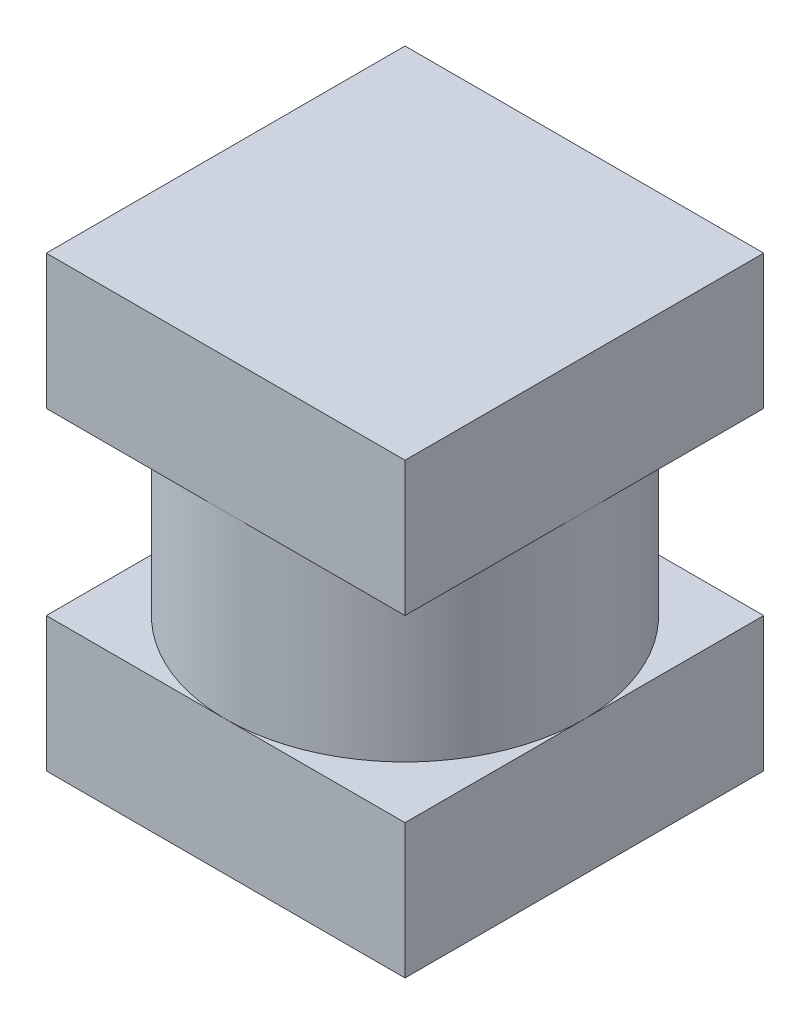
ISO-10303-21;
HEADER;
FILE_DESCRIPTION(('STEP AP214'),'2;1');
FILE_NAME('part.step','',(''),(''),'','','');
FILE_SCHEMA(('AUTOMOTIVE_DESIGN { 1 0 10303 214 1 1 1 1 }'));
ENDSEC;
DATA;
#1=APPLICATION_CONTEXT('core data for automotive mechanical design processes');
#2=APPLICATION_PROTOCOL_DEFINITION('international standard','automotive_design',2000,#1);
#3=PRODUCT_CONTEXT('',#1,'mechanical');
#4=PRODUCT('Part','Part','',(#3));
#5=PRODUCT_RELATED_PRODUCT_CATEGORY('part','',(#4));
#6=PRODUCT_DEFINITION_FORMATION('','',#4);
#7=PRODUCT_DEFINITION_CONTEXT('part definition',#1,'design');
#8=PRODUCT_DEFINITION('design','',#6,#7);
#9=PRODUCT_DEFINITION_SHAPE('','',#8);
#10=(LENGTH_UNIT() NAMED_UNIT(*) SI_UNIT(.MILLI.,.METRE.));
#11=(NAMED_UNIT(*) PLANE_ANGLE_UNIT() SI_UNIT($,.RADIAN.));
#12=(NAMED_UNIT(*) SI_UNIT($,.STERADIAN.) SOLID_ANGLE_UNIT());
#13=UNCERTAINTY_MEASURE_WITH_UNIT(LENGTH_MEASURE(1.E-05),#10,'distance_accuracy_value','');
#14=(GEOMETRIC_REPRESENTATION_CONTEXT(3) GLOBAL_UNCERTAINTY_ASSIGNED_CONTEXT((#13)) GLOBAL_UNIT_ASSIGNED_CONTEXT((#10,
#11,#12)) REPRESENTATION_CONTEXT('',''));
#15=CARTESIAN_POINT('',(0.,0.,0.));
#16=DIRECTION('',(0.,0.,1.));
#17=DIRECTION('',(1.,0.,0.));
#18=AXIS2_PLACEMENT_3D('',#15,#16,#17);
#19=CARTESIAN_POINT('',(0.,15.,0.));
#20=DIRECTION('',(0.,1.,0.));
#21=DIRECTION('',(0.,0.,1.));
#22=AXIS2_PLACEMENT_3D('',#19,#20,#21);
#23=PLANE('',#22);
#24=CARTESIAN_POINT('',(0.,15.,0.));
#25=DIRECTION('',(0.,1.,0.));
#26=DIRECTION('',(0.,0.,1.));
#27=AXIS2_PLACEMENT_3D('',#24,#25,#26);
#28=CIRCLE('',#27,20.);
#29=CARTESIAN_POINT('',(0.,15.,20.));
#30=VERTEX_POINT('',#29);
#31=CARTESIAN_POINT('',(20.,15.,0.));
#32=VERTEX_POINT('',#31);
#33=EDGE_CURVE('E46',#30,#32,#28,.T.);
#34=ORIENTED_EDGE('',*,*,#33,.F.);
#35=DIRECTION('',(1.,0.,0.));
#36=VECTOR('',#35,1.);
#37=CARTESIAN_POINT('',(-20.,15.,20.));
#38=LINE('',#37,#36);
#39=CARTESIAN_POINT('',(20.,15.,20.));
#40=VERTEX_POINT('',#39);
#41=EDGE_CURVE('E176',#30,#40,#38,.T.);
#42=ORIENTED_EDGE('',*,*,#41,.T.);
#43=DIRECTION('',(0.,0.,-1.));
#44=VECTOR('',#43,1.);
#45=CARTESIAN_POINT('',(20.,15.,-20.));
#46=LINE('',#45,#44);
#47=EDGE_CURVE('E164',#40,#32,#46,.T.);
#48=ORIENTED_EDGE('',*,*,#47,.T.);
#49=EDGE_LOOP('',(#34,#42,#48));
#50=FACE_BOUND('',#49,.T.);
#51=ADVANCED_FACE('F35',(#50),#23,.T.);
#52=CARTESIAN_POINT('',(0.,15.,-20.));
#53=VERTEX_POINT('',#52);
#54=EDGE_CURVE('E11',#32,#53,#28,.T.);
#55=ORIENTED_EDGE('',*,*,#54,.F.);
#56=CARTESIAN_POINT('',(20.,15.,-20.));
#57=VERTEX_POINT('',#56);
#58=EDGE_CURVE('E168',#32,#57,#46,.T.);
#59=ORIENTED_EDGE('',*,*,#58,.T.);
#60=DIRECTION('',(-1.,0.,0.));
#61=VECTOR('',#60,1.);
#62=CARTESIAN_POINT('',(-20.,15.,-20.));
#63=LINE('',#62,#61);
#64=EDGE_CURVE('E169',#57,#53,#63,.T.);
#65=ORIENTED_EDGE('',*,*,#64,.T.);
#66=EDGE_LOOP('',(#55,#59,#65));
#67=FACE_BOUND('',#66,.T.);
#68=ADVANCED_FACE('F211',(#67),#23,.T.);
#69=CARTESIAN_POINT('',(-20.,15.,0.));
#70=VERTEX_POINT('',#69);
#71=EDGE_CURVE('E44',#53,#70,#28,.T.);
#72=ORIENTED_EDGE('',*,*,#71,.F.);
#73=CARTESIAN_POINT('',(-20.,15.,-20.));
#74=VERTEX_POINT('',#73);
#75=EDGE_CURVE('E167',#53,#74,#63,.T.);
#76=ORIENTED_EDGE('',*,*,#75,.T.);
#77=DIRECTION('',(0.,0.,1.));
#78=VECTOR('',#77,1.);
#79=CARTESIAN_POINT('',(-20.,15.,-20.));
#80=LINE('',#79,#78);
#81=EDGE_CURVE('E173',#74,#70,#80,.T.);
#82=ORIENTED_EDGE('',*,*,#81,.T.);
#83=EDGE_LOOP('',(#72,#76,#82));
#84=FACE_BOUND('',#83,.T.);
#85=ADVANCED_FACE('F208',(#84),#23,.T.);
#86=CARTESIAN_POINT('',(20.,15.,-20.));
#87=DIRECTION('',(-1.,0.,0.));
#88=DIRECTION('',(0.,0.,1.));
#89=AXIS2_PLACEMENT_3D('',#86,#87,#88);
#90=PLANE('',#89);
#91=DIRECTION('',(0.,0.,-1.));
#92=VECTOR('',#91,1.);
#93=CARTESIAN_POINT('',(20.,0.,-20.));
#94=LINE('',#93,#92);
#95=CARTESIAN_POINT('',(20.,0.,20.));
#96=VERTEX_POINT('',#95);
#97=CARTESIAN_POINT('',(20.,0.,-20.));
#98=VERTEX_POINT('',#97);
#99=EDGE_CURVE('E161',#96,#98,#94,.T.);
#100=ORIENTED_EDGE('',*,*,#99,.T.);
#101=DIRECTION('',(0.,-1.,0.));
#102=VECTOR('',#101,1.);
#103=CARTESIAN_POINT('',(20.,15.,-20.));
#104=LINE('',#103,#102);
#105=EDGE_CURVE('E39',#57,#98,#104,.T.);
#106=ORIENTED_EDGE('',*,*,#105,.F.);
#107=ORIENTED_EDGE('',*,*,#58,.F.);
#108=ORIENTED_EDGE('',*,*,#47,.F.);
#109=DIRECTION('',(0.,-1.,0.));
#110=VECTOR('',#109,1.);
#111=CARTESIAN_POINT('',(20.,15.,20.));
#112=LINE('',#111,#110);
#113=EDGE_CURVE('E179',#40,#96,#112,.T.);
#114=ORIENTED_EDGE('',*,*,#113,.T.);
#115=EDGE_LOOP('',(#100,#106,#107,#108,#114));
#116=FACE_BOUND('',#115,.T.);
#117=ADVANCED_FACE('F37',(#116),#90,.F.);
#118=CARTESIAN_POINT('',(-20.,15.,-20.));
#119=DIRECTION('',(0.,0.,1.));
#120=DIRECTION('',(1.,0.,0.));
#121=AXIS2_PLACEMENT_3D('',#118,#119,#120);
#122=PLANE('',#121);
#123=DIRECTION('',(-1.,0.,0.));
#124=VECTOR('',#123,1.);
#125=CARTESIAN_POINT('',(-20.,0.,-20.));
#126=LINE('',#125,#124);
#127=CARTESIAN_POINT('',(-20.,0.,-20.));
#128=VERTEX_POINT('',#127);
#129=EDGE_CURVE('E182',#98,#128,#126,.T.);
#130=ORIENTED_EDGE('',*,*,#129,.T.);
#131=DIRECTION('',(0.,-1.,0.));
#132=VECTOR('',#131,1.);
#133=CARTESIAN_POINT('',(-20.,15.,-20.));
#134=LINE('',#133,#132);
#135=EDGE_CURVE('E192',#74,#128,#134,.T.);
#136=ORIENTED_EDGE('',*,*,#135,.F.);
#137=ORIENTED_EDGE('',*,*,#75,.F.);
#138=ORIENTED_EDGE('',*,*,#64,.F.);
#139=ORIENTED_EDGE('',*,*,#105,.T.);
#140=EDGE_LOOP('',(#130,#136,#137,#138,#139));
#141=FACE_BOUND('',#140,.T.);
#142=ADVANCED_FACE('F209',(#141),#122,.F.);
#143=CARTESIAN_POINT('',(-20.,15.,-20.));
#144=DIRECTION('',(1.,0.,0.));
#145=DIRECTION('',(0.,0.,-1.));
#146=AXIS2_PLACEMENT_3D('',#143,#144,#145);
#147=PLANE('',#146);
#148=DIRECTION('',(0.,0.,1.));
#149=VECTOR('',#148,1.);
#150=CARTESIAN_POINT('',(-20.,0.,-20.));
#151=LINE('',#150,#149);
#152=CARTESIAN_POINT('',(-20.,0.,20.));
#153=VERTEX_POINT('',#152);
#154=EDGE_CURVE('E184',#128,#153,#151,.T.);
#155=ORIENTED_EDGE('',*,*,#154,.T.);
#156=DIRECTION('',(0.,-1.,0.));
#157=VECTOR('',#156,1.);
#158=CARTESIAN_POINT('',(-20.,15.,20.));
#159=LINE('',#158,#157);
#160=CARTESIAN_POINT('',(-20.,15.,20.));
#161=VERTEX_POINT('',#160);
#162=EDGE_CURVE('E190',#161,#153,#159,.T.);
#163=ORIENTED_EDGE('',*,*,#162,.F.);
#164=EDGE_CURVE('E172',#70,#161,#80,.T.);
#165=ORIENTED_EDGE('',*,*,#164,.F.);
#166=ORIENTED_EDGE('',*,*,#81,.F.);
#167=ORIENTED_EDGE('',*,*,#135,.T.);
#168=EDGE_LOOP('',(#155,#163,#165,#166,#167));
#169=FACE_BOUND('',#168,.T.);
#170=ADVANCED_FACE('F227',(#169),#147,.F.);
#171=CARTESIAN_POINT('',(-20.,15.,20.));
#172=DIRECTION('',(0.,0.,-1.));
#173=DIRECTION('',(-1.,0.,0.));
#174=AXIS2_PLACEMENT_3D('',#171,#172,#173);
#175=PLANE('',#174);
#176=DIRECTION('',(1.,0.,0.));
#177=VECTOR('',#176,1.);
#178=CARTESIAN_POINT('',(-20.,0.,20.));
#179=LINE('',#178,#177);
#180=EDGE_CURVE('E186',#153,#96,#179,.T.);
#181=ORIENTED_EDGE('',*,*,#180,.T.);
#182=ORIENTED_EDGE('',*,*,#113,.F.);
#183=ORIENTED_EDGE('',*,*,#41,.F.);
#184=EDGE_CURVE('E177',#161,#30,#38,.T.);
#185=ORIENTED_EDGE('',*,*,#184,.F.);
#186=ORIENTED_EDGE('',*,*,#162,.T.);
#187=EDGE_LOOP('',(#181,#182,#183,#185,#186));
#188=FACE_BOUND('',#187,.T.);
#189=ADVANCED_FACE('F221',(#188),#175,.F.);
#190=EDGE_CURVE('E154',#70,#30,#28,.T.);
#191=ORIENTED_EDGE('',*,*,#190,.F.);
#192=ORIENTED_EDGE('',*,*,#164,.T.);
#193=ORIENTED_EDGE('',*,*,#184,.T.);
#194=EDGE_LOOP('',(#191,#192,#193));
#195=FACE_BOUND('',#194,.T.);
#196=ADVANCED_FACE('F230',(#195),#23,.T.);
#197=CARTESIAN_POINT('',(0.,0.,0.));
#198=DIRECTION('',(0.,1.,0.));
#199=DIRECTION('',(0.,0.,1.));
#200=AXIS2_PLACEMENT_3D('',#197,#198,#199);
#201=PLANE('',#200);
#202=ORIENTED_EDGE('',*,*,#99,.F.);
#203=ORIENTED_EDGE('',*,*,#180,.F.);
#204=ORIENTED_EDGE('',*,*,#154,.F.);
#205=ORIENTED_EDGE('',*,*,#129,.F.);
#206=EDGE_LOOP('',(#202,#203,#204,#205));
#207=FACE_BOUND('',#206,.T.);
#208=ADVANCED_FACE('F225',(#207),#201,.F.);
#209=CARTESIAN_POINT('',(0.,35.,0.));
#210=DIRECTION('',(0.,-1.,0.));
#211=DIRECTION('',(0.,0.,-1.));
#212=AXIS2_PLACEMENT_3D('',#209,#210,#211);
#213=CYLINDRICAL_SURFACE('',#212,20.);
#214=CARTESIAN_POINT('',(0.,35.,0.));
#215=DIRECTION('',(0.,1.,0.));
#216=DIRECTION('',(0.,0.,1.));
#217=AXIS2_PLACEMENT_3D('',#214,#215,#216);
#218=CIRCLE('',#217,20.);
#219=CARTESIAN_POINT('',(0.,35.,20.));
#220=VERTEX_POINT('',#219);
#221=CARTESIAN_POINT('',(20.,35.,0.));
#222=VERTEX_POINT('',#221);
#223=EDGE_CURVE('E159',#220,#222,#218,.T.);
#224=ORIENTED_EDGE('',*,*,#223,.F.);
#225=CARTESIAN_POINT('',(-20.,35.,0.));
#226=VERTEX_POINT('',#225);
#227=EDGE_CURVE('E53',#226,#220,#218,.T.);
#228=ORIENTED_EDGE('',*,*,#227,.F.);
#229=CARTESIAN_POINT('',(0.,35.,-20.));
#230=VERTEX_POINT('',#229);
#231=EDGE_CURVE('E57',#230,#226,#218,.T.);
#232=ORIENTED_EDGE('',*,*,#231,.F.);
#233=EDGE_CURVE('E162',#222,#230,#218,.T.);
#234=ORIENTED_EDGE('',*,*,#233,.F.);
#235=EDGE_LOOP('',(#224,#228,#232,#234));
#236=FACE_BOUND('',#235,.T.);
#237=ORIENTED_EDGE('',*,*,#33,.T.);
#238=ORIENTED_EDGE('',*,*,#54,.T.);
#239=ORIENTED_EDGE('',*,*,#71,.T.);
#240=ORIENTED_EDGE('',*,*,#190,.T.);
#241=EDGE_LOOP('',(#237,#238,#239,#240));
#242=FACE_BOUND('',#241,.T.);
#243=ADVANCED_FACE('F205',(#236,#242),#213,.T.);
#244=CARTESIAN_POINT('',(0.,35.,0.));
#245=DIRECTION('',(0.,-1.,0.));
#246=DIRECTION('',(0.,0.,-1.));
#247=AXIS2_PLACEMENT_3D('',#244,#245,#246);
#248=PLANE('',#247);
#249=DIRECTION('',(1.,0.,0.));
#250=VECTOR('',#249,1.);
#251=CARTESIAN_POINT('',(-20.,35.,20.));
#252=LINE('',#251,#250);
#253=CARTESIAN_POINT('',(20.,35.,20.));
#254=VERTEX_POINT('',#253);
#255=EDGE_CURVE('E365',#220,#254,#252,.T.);
#256=ORIENTED_EDGE('',*,*,#255,.F.);
#257=ORIENTED_EDGE('',*,*,#223,.T.);
#258=DIRECTION('',(0.,0.,-1.));
#259=VECTOR('',#258,1.);
#260=CARTESIAN_POINT('',(20.,35.,20.));
#261=LINE('',#260,#259);
#262=EDGE_CURVE('E373',#254,#222,#261,.T.);
#263=ORIENTED_EDGE('',*,*,#262,.F.);
#264=EDGE_LOOP('',(#256,#257,#263));
#265=FACE_BOUND('',#264,.T.);
#266=ADVANCED_FACE('F269',(#265),#248,.T.);
#267=CARTESIAN_POINT('',(20.,35.,-20.));
#268=VERTEX_POINT('',#267);
#269=EDGE_CURVE('E150',#222,#268,#261,.T.);
#270=ORIENTED_EDGE('',*,*,#269,.F.);
#271=ORIENTED_EDGE('',*,*,#233,.T.);
#272=DIRECTION('',(-1.,0.,0.));
#273=VECTOR('',#272,1.);
#274=CARTESIAN_POINT('',(-20.,35.,-20.));
#275=LINE('',#274,#273);
#276=EDGE_CURVE('E361',#268,#230,#275,.T.);
#277=ORIENTED_EDGE('',*,*,#276,.F.);
#278=EDGE_LOOP('',(#270,#271,#277));
#279=FACE_BOUND('',#278,.T.);
#280=ADVANCED_FACE('F274',(#279),#248,.T.);
#281=CARTESIAN_POINT('',(-20.,35.,-20.));
#282=VERTEX_POINT('',#281);
#283=EDGE_CURVE('E374',#230,#282,#275,.T.);
#284=ORIENTED_EDGE('',*,*,#283,.F.);
#285=ORIENTED_EDGE('',*,*,#231,.T.);
#286=DIRECTION('',(0.,0.,1.));
#287=VECTOR('',#286,1.);
#288=CARTESIAN_POINT('',(-20.,35.,20.));
#289=LINE('',#288,#287);
#290=EDGE_CURVE('E360',#282,#226,#289,.T.);
#291=ORIENTED_EDGE('',*,*,#290,.F.);
#292=EDGE_LOOP('',(#284,#285,#291));
#293=FACE_BOUND('',#292,.T.);
#294=ADVANCED_FACE('F283',(#293),#248,.T.);
#295=CARTESIAN_POINT('',(20.,50.,20.));
#296=DIRECTION('',(-1.,0.,0.));
#297=DIRECTION('',(0.,0.,1.));
#298=AXIS2_PLACEMENT_3D('',#295,#296,#297);
#299=PLANE('',#298);
#300=ORIENTED_EDGE('',*,*,#262,.T.);
#301=ORIENTED_EDGE('',*,*,#269,.T.);
#302=DIRECTION('',(0.,-1.,0.));
#303=VECTOR('',#302,1.);
#304=CARTESIAN_POINT('',(20.,50.,-20.));
#305=LINE('',#304,#303);
#306=CARTESIAN_POINT('',(20.,50.,-20.));
#307=VERTEX_POINT('',#306);
#308=EDGE_CURVE('E130',#307,#268,#305,.T.);
#309=ORIENTED_EDGE('',*,*,#308,.F.);
#310=DIRECTION('',(0.,0.,-1.));
#311=VECTOR('',#310,1.);
#312=CARTESIAN_POINT('',(20.,50.,20.));
#313=LINE('',#312,#311);
#314=CARTESIAN_POINT('',(20.,50.,20.));
#315=VERTEX_POINT('',#314);
#316=EDGE_CURVE('E136',#315,#307,#313,.T.);
#317=ORIENTED_EDGE('',*,*,#316,.F.);
#318=DIRECTION('',(0.,-1.,0.));
#319=VECTOR('',#318,1.);
#320=CARTESIAN_POINT('',(20.,50.,20.));
#321=LINE('',#320,#319);
#322=EDGE_CURVE('E370',#315,#254,#321,.T.);
#323=ORIENTED_EDGE('',*,*,#322,.T.);
#324=EDGE_LOOP('',(#300,#301,#309,#317,#323));
#325=FACE_BOUND('',#324,.T.);
#326=ADVANCED_FACE('F148',(#325),#299,.F.);
#327=CARTESIAN_POINT('',(-20.,50.,-20.));
#328=DIRECTION('',(0.,0.,1.));
#329=DIRECTION('',(1.,0.,0.));
#330=AXIS2_PLACEMENT_3D('',#327,#328,#329);
#331=PLANE('',#330);
#332=ORIENTED_EDGE('',*,*,#276,.T.);
#333=ORIENTED_EDGE('',*,*,#283,.T.);
#334=DIRECTION('',(0.,-1.,0.));
#335=VECTOR('',#334,1.);
#336=CARTESIAN_POINT('',(-20.,50.,-20.));
#337=LINE('',#336,#335);
#338=CARTESIAN_POINT('',(-20.,50.,-20.));
#339=VERTEX_POINT('',#338);
#340=EDGE_CURVE('E132',#339,#282,#337,.T.);
#341=ORIENTED_EDGE('',*,*,#340,.F.);
#342=DIRECTION('',(-1.,0.,0.));
#343=VECTOR('',#342,1.);
#344=CARTESIAN_POINT('',(-20.,50.,-20.));
#345=LINE('',#344,#343);
#346=EDGE_CURVE('E125',#307,#339,#345,.T.);
#347=ORIENTED_EDGE('',*,*,#346,.F.);
#348=ORIENTED_EDGE('',*,*,#308,.T.);
#349=EDGE_LOOP('',(#332,#333,#341,#347,#348));
#350=FACE_BOUND('',#349,.T.);
#351=ADVANCED_FACE('F128',(#350),#331,.F.);
#352=CARTESIAN_POINT('',(-20.,50.,20.));
#353=DIRECTION('',(1.,0.,0.));
#354=DIRECTION('',(0.,0.,-1.));
#355=AXIS2_PLACEMENT_3D('',#352,#353,#354);
#356=PLANE('',#355);
#357=ORIENTED_EDGE('',*,*,#290,.T.);
#358=CARTESIAN_POINT('',(-20.,35.,20.));
#359=VERTEX_POINT('',#358);
#360=EDGE_CURVE('E354',#226,#359,#289,.T.);
#361=ORIENTED_EDGE('',*,*,#360,.T.);
#362=DIRECTION('',(0.,-1.,0.));
#363=VECTOR('',#362,1.);
#364=CARTESIAN_POINT('',(-20.,50.,20.));
#365=LINE('',#364,#363);
#366=CARTESIAN_POINT('',(-20.,50.,20.));
#367=VERTEX_POINT('',#366);
#368=EDGE_CURVE('E155',#367,#359,#365,.T.);
#369=ORIENTED_EDGE('',*,*,#368,.F.);
#370=DIRECTION('',(0.,0.,1.));
#371=VECTOR('',#370,1.);
#372=CARTESIAN_POINT('',(-20.,50.,20.));
#373=LINE('',#372,#371);
#374=EDGE_CURVE('E135',#339,#367,#373,.T.);
#375=ORIENTED_EDGE('',*,*,#374,.F.);
#376=ORIENTED_EDGE('',*,*,#340,.T.);
#377=EDGE_LOOP('',(#357,#361,#369,#375,#376));
#378=FACE_BOUND('',#377,.T.);
#379=ADVANCED_FACE('F302',(#378),#356,.F.);
#380=CARTESIAN_POINT('',(-20.,50.,20.));
#381=DIRECTION('',(0.,0.,-1.));
#382=DIRECTION('',(-1.,0.,0.));
#383=AXIS2_PLACEMENT_3D('',#380,#381,#382);
#384=PLANE('',#383);
#385=EDGE_CURVE('E145',#359,#220,#252,.T.);
#386=ORIENTED_EDGE('',*,*,#385,.T.);
#387=ORIENTED_EDGE('',*,*,#255,.T.);
#388=ORIENTED_EDGE('',*,*,#322,.F.);
#389=DIRECTION('',(1.,0.,0.));
#390=VECTOR('',#389,1.);
#391=CARTESIAN_POINT('',(-20.,50.,20.));
#392=LINE('',#391,#390);
#393=EDGE_CURVE('E141',#367,#315,#392,.T.);
#394=ORIENTED_EDGE('',*,*,#393,.F.);
#395=ORIENTED_EDGE('',*,*,#368,.T.);
#396=EDGE_LOOP('',(#386,#387,#388,#394,#395));
#397=FACE_BOUND('',#396,.T.);
#398=ADVANCED_FACE('F309',(#397),#384,.F.);
#399=CARTESIAN_POINT('',(0.,50.,0.));
#400=DIRECTION('',(0.,-1.,0.));
#401=DIRECTION('',(0.,0.,-1.));
#402=AXIS2_PLACEMENT_3D('',#399,#400,#401);
#403=PLANE('',#402);
#404=ORIENTED_EDGE('',*,*,#316,.T.);
#405=ORIENTED_EDGE('',*,*,#346,.T.);
#406=ORIENTED_EDGE('',*,*,#374,.T.);
#407=ORIENTED_EDGE('',*,*,#393,.T.);
#408=EDGE_LOOP('',(#404,#405,#406,#407));
#409=FACE_BOUND('',#408,.T.);
#410=ADVANCED_FACE('F139',(#409),#403,.F.);
#411=ORIENTED_EDGE('',*,*,#360,.F.);
#412=ORIENTED_EDGE('',*,*,#227,.T.);
#413=ORIENTED_EDGE('',*,*,#385,.F.);
#414=EDGE_LOOP('',(#411,#412,#413));
#415=FACE_BOUND('',#414,.T.);
#416=ADVANCED_FACE('F277',(#415),#248,.T.);
#417=CLOSED_SHELL('',(#51,#68,#85,#117,#142,#170,#189,#196,#208,#243,#266,#280,#294,#326,#351,
#379,#398,#410,#416));
#418=MANIFOLD_SOLID_BREP('B2',#417);
#419=ADVANCED_BREP_SHAPE_REPRESENTATION('',(#18,#418),#14);
#420=SHAPE_DEFINITION_REPRESENTATION(#9,#419);
ENDSEC;
END-ISO-10303-21;
